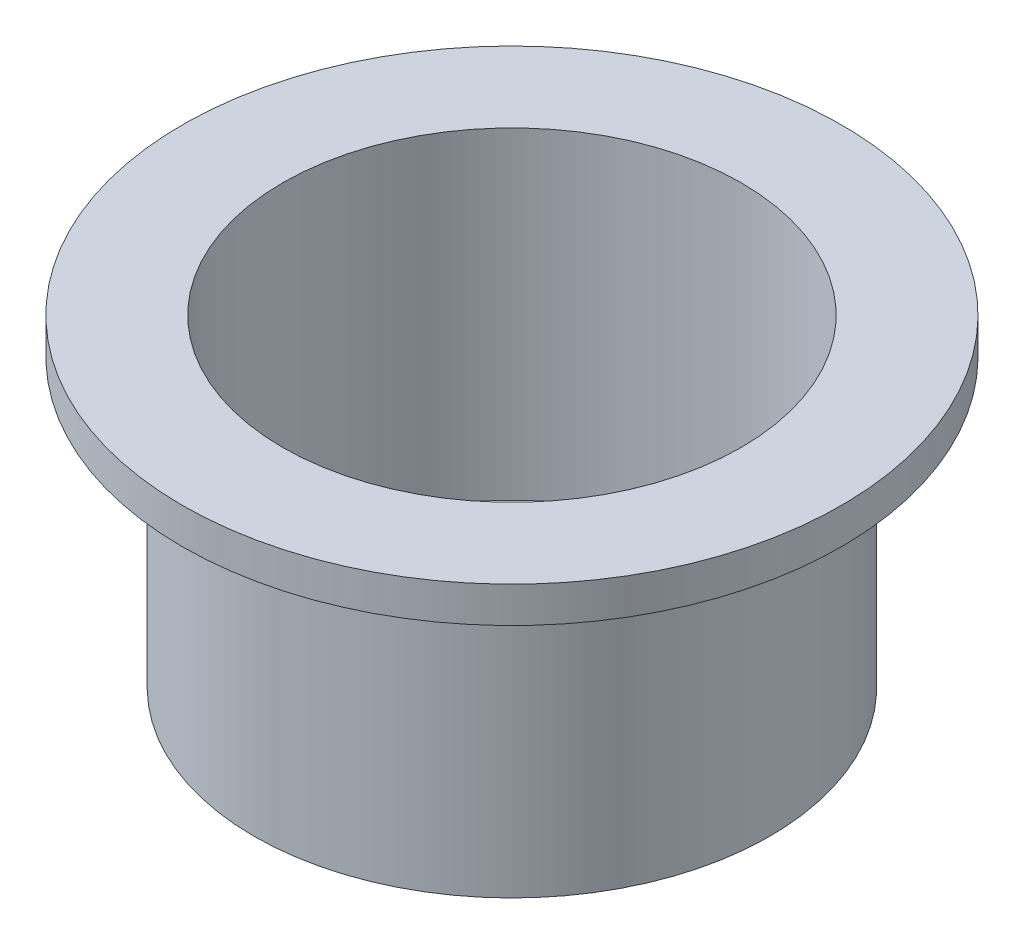
ISO-10303-21;
HEADER;
FILE_DESCRIPTION(('STEP AP214'),'2;1');
FILE_NAME('part.step','',(''),(''),'','','');
FILE_SCHEMA(('AUTOMOTIVE_DESIGN { 1 0 10303 214 1 1 1 1 }'));
ENDSEC;
DATA;
#1=APPLICATION_CONTEXT('core data for automotive mechanical design processes');
#2=APPLICATION_PROTOCOL_DEFINITION('international standard','automotive_design',2000,#1);
#3=PRODUCT_CONTEXT('',#1,'mechanical');
#4=PRODUCT('Part','Part','',(#3));
#5=PRODUCT_RELATED_PRODUCT_CATEGORY('part','',(#4));
#6=PRODUCT_DEFINITION_FORMATION('','',#4);
#7=PRODUCT_DEFINITION_CONTEXT('part definition',#1,'design');
#8=PRODUCT_DEFINITION('design','',#6,#7);
#9=PRODUCT_DEFINITION_SHAPE('','',#8);
#10=(LENGTH_UNIT() NAMED_UNIT(*) SI_UNIT(.MILLI.,.METRE.));
#11=(NAMED_UNIT(*) PLANE_ANGLE_UNIT() SI_UNIT($,.RADIAN.));
#12=(NAMED_UNIT(*) SI_UNIT($,.STERADIAN.) SOLID_ANGLE_UNIT());
#13=UNCERTAINTY_MEASURE_WITH_UNIT(LENGTH_MEASURE(1.E-05),#10,'distance_accuracy_value','');
#14=(GEOMETRIC_REPRESENTATION_CONTEXT(3) GLOBAL_UNCERTAINTY_ASSIGNED_CONTEXT((#13)) GLOBAL_UNIT_ASSIGNED_CONTEXT((#10,
#11,#12)) REPRESENTATION_CONTEXT('',''));
#15=CARTESIAN_POINT('',(0.,0.,0.));
#16=DIRECTION('',(0.,0.,1.));
#17=DIRECTION('',(1.,0.,0.));
#18=AXIS2_PLACEMENT_3D('',#15,#16,#17);
#19=CARTESIAN_POINT('',(0.,0.,0.));
#20=DIRECTION('',(0.,1.,0.));
#21=DIRECTION('',(0.,0.,1.));
#22=AXIS2_PLACEMENT_3D('',#19,#20,#21);
#23=PLANE('',#22);
#24=CARTESIAN_POINT('',(0.,0.,0.));
#25=DIRECTION('',(0.,1.,0.));
#26=DIRECTION('',(0.,0.,1.));
#27=AXIS2_PLACEMENT_3D('',#24,#25,#26);
#28=CIRCLE('',#27,11.43);
#29=CARTESIAN_POINT('',(0.,0.,11.43));
#30=VERTEX_POINT('',#29);
#31=EDGE_CURVE('E38',#30,#30,#28,.T.);
#32=ORIENTED_EDGE('',*,*,#31,.F.);
#33=EDGE_LOOP('',(#32));
#34=FACE_BOUND('',#33,.T.);
#35=CARTESIAN_POINT('',(0.,0.,0.));
#36=DIRECTION('',(0.,1.,0.));
#37=DIRECTION('',(0.,0.,1.));
#38=AXIS2_PLACEMENT_3D('',#35,#36,#37);
#39=CIRCLE('',#38,10.16);
#40=CARTESIAN_POINT('',(0.,0.,10.16));
#41=VERTEX_POINT('',#40);
#42=EDGE_CURVE('E45',#41,#41,#39,.T.);
#43=ORIENTED_EDGE('',*,*,#42,.T.);
#44=EDGE_LOOP('',(#43));
#45=FACE_BOUND('',#44,.T.);
#46=ADVANCED_FACE('F34',(#34,#45),#23,.F.);
#47=CARTESIAN_POINT('',(0.,12.7,0.));
#48=DIRECTION('',(0.,-1.,0.));
#49=DIRECTION('',(0.,0.,-1.));
#50=AXIS2_PLACEMENT_3D('',#47,#48,#49);
#51=CYLINDRICAL_SURFACE('',#50,11.43);
#52=CARTESIAN_POINT('',(0.,12.7,0.));
#53=DIRECTION('',(0.,1.,0.));
#54=DIRECTION('',(0.,0.,1.));
#55=AXIS2_PLACEMENT_3D('',#52,#53,#54);
#56=CIRCLE('',#55,11.43);
#57=CARTESIAN_POINT('',(0.,12.7,11.43));
#58=VERTEX_POINT('',#57);
#59=EDGE_CURVE('E10',#58,#58,#56,.T.);
#60=ORIENTED_EDGE('',*,*,#59,.F.);
#61=EDGE_LOOP('',(#60));
#62=FACE_BOUND('',#61,.T.);
#63=ORIENTED_EDGE('',*,*,#31,.T.);
#64=EDGE_LOOP('',(#63));
#65=FACE_BOUND('',#64,.T.);
#66=ADVANCED_FACE('F36',(#62,#65),#51,.T.);
#67=CARTESIAN_POINT('',(0.,12.7,0.));
#68=DIRECTION('',(0.,-1.,0.));
#69=DIRECTION('',(0.,0.,-1.));
#70=AXIS2_PLACEMENT_3D('',#67,#68,#69);
#71=CYLINDRICAL_SURFACE('',#70,10.16);
#72=ORIENTED_EDGE('',*,*,#42,.F.);
#73=EDGE_LOOP('',(#72));
#74=FACE_BOUND('',#73,.T.);
#75=CARTESIAN_POINT('',(0.,14.2875,0.));
#76=DIRECTION('',(0.,1.,0.));
#77=DIRECTION('',(0.,0.,1.));
#78=AXIS2_PLACEMENT_3D('',#75,#76,#77);
#79=CIRCLE('',#78,10.16);
#80=CARTESIAN_POINT('',(0.,14.2875,10.16));
#81=VERTEX_POINT('',#80);
#82=EDGE_CURVE('E53',#81,#81,#79,.T.);
#83=ORIENTED_EDGE('',*,*,#82,.T.);
#84=EDGE_LOOP('',(#83));
#85=FACE_BOUND('',#84,.T.);
#86=ADVANCED_FACE('F59',(#74,#85),#71,.F.);
#87=CARTESIAN_POINT('',(0.,14.2875,0.));
#88=DIRECTION('',(0.,1.,0.));
#89=DIRECTION('',(0.,0.,1.));
#90=AXIS2_PLACEMENT_3D('',#87,#88,#89);
#91=PLANE('',#90);
#92=CARTESIAN_POINT('',(0.,14.2875,0.));
#93=DIRECTION('',(0.,1.,0.));
#94=DIRECTION('',(0.,0.,1.));
#95=AXIS2_PLACEMENT_3D('',#92,#93,#94);
#96=CIRCLE('',#95,14.605);
#97=CARTESIAN_POINT('',(0.,14.2875,14.605));
#98=VERTEX_POINT('',#97);
#99=EDGE_CURVE('E49',#98,#98,#96,.T.);
#100=ORIENTED_EDGE('',*,*,#99,.T.);
#101=EDGE_LOOP('',(#100));
#102=FACE_BOUND('',#101,.T.);
#103=ORIENTED_EDGE('',*,*,#82,.F.);
#104=EDGE_LOOP('',(#103));
#105=FACE_BOUND('',#104,.T.);
#106=ADVANCED_FACE('F61',(#102,#105),#91,.T.);
#107=CARTESIAN_POINT('',(0.,12.7,0.));
#108=DIRECTION('',(0.,1.,0.));
#109=DIRECTION('',(0.,0.,1.));
#110=AXIS2_PLACEMENT_3D('',#107,#108,#109);
#111=PLANE('',#110);
#112=ORIENTED_EDGE('',*,*,#59,.T.);
#113=EDGE_LOOP('',(#112));
#114=FACE_BOUND('',#113,.T.);
#115=CARTESIAN_POINT('',(0.,12.7,0.));
#116=DIRECTION('',(0.,1.,0.));
#117=DIRECTION('',(0.,0.,1.));
#118=AXIS2_PLACEMENT_3D('',#115,#116,#117);
#119=CIRCLE('',#118,14.605);
#120=CARTESIAN_POINT('',(0.,12.7,14.605));
#121=VERTEX_POINT('',#120);
#122=EDGE_CURVE('E50',#121,#121,#119,.T.);
#123=ORIENTED_EDGE('',*,*,#122,.F.);
#124=EDGE_LOOP('',(#123));
#125=FACE_BOUND('',#124,.T.);
#126=ADVANCED_FACE('F63',(#114,#125),#111,.F.);
#127=CARTESIAN_POINT('',(0.,14.2875,0.));
#128=DIRECTION('',(0.,-1.,0.));
#129=DIRECTION('',(0.,0.,-1.));
#130=AXIS2_PLACEMENT_3D('',#127,#128,#129);
#131=CYLINDRICAL_SURFACE('',#130,14.605);
#132=ORIENTED_EDGE('',*,*,#99,.F.);
#133=EDGE_LOOP('',(#132));
#134=FACE_BOUND('',#133,.T.);
#135=ORIENTED_EDGE('',*,*,#122,.T.);
#136=EDGE_LOOP('',(#135));
#137=FACE_BOUND('',#136,.T.);
#138=ADVANCED_FACE('F70',(#134,#137),#131,.T.);
#139=CLOSED_SHELL('',(#46,#66,#86,#106,#126,#138));
#140=MANIFOLD_SOLID_BREP('B2',#139);
#141=ADVANCED_BREP_SHAPE_REPRESENTATION('',(#18,#140),#14);
#142=SHAPE_DEFINITION_REPRESENTATION(#9,#141);
ENDSEC;
END-ISO-10303-21;
